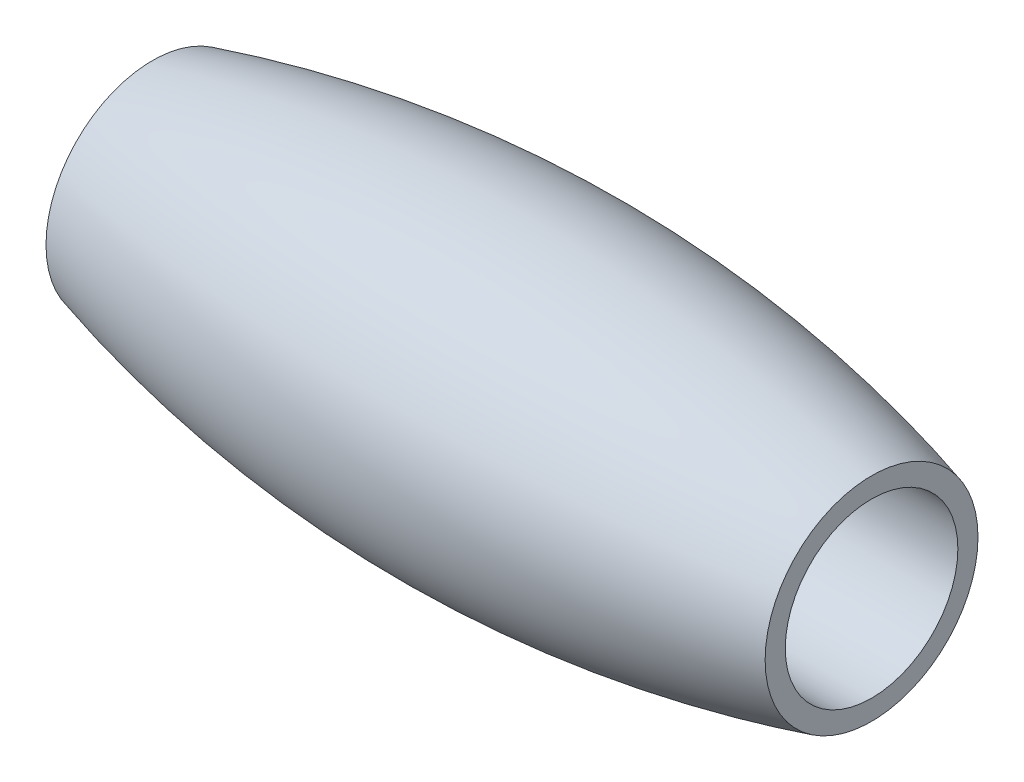
ISO-10303-21;
HEADER;
FILE_DESCRIPTION(('STEP AP214'),'2;1');
FILE_NAME('part.step','',(''),(''),'','','');
FILE_SCHEMA(('AUTOMOTIVE_DESIGN { 1 0 10303 214 1 1 1 1 }'));
ENDSEC;
DATA;
#1=APPLICATION_CONTEXT('core data for automotive mechanical design processes');
#2=APPLICATION_PROTOCOL_DEFINITION('international standard','automotive_design',2000,#1);
#3=PRODUCT_CONTEXT('',#1,'mechanical');
#4=PRODUCT('Part','Part','',(#3));
#5=PRODUCT_RELATED_PRODUCT_CATEGORY('part','',(#4));
#6=PRODUCT_DEFINITION_FORMATION('','',#4);
#7=PRODUCT_DEFINITION_CONTEXT('part definition',#1,'design');
#8=PRODUCT_DEFINITION('design','',#6,#7);
#9=PRODUCT_DEFINITION_SHAPE('','',#8);
#10=(LENGTH_UNIT() NAMED_UNIT(*) SI_UNIT(.MILLI.,.METRE.));
#11=(NAMED_UNIT(*) PLANE_ANGLE_UNIT() SI_UNIT($,.RADIAN.));
#12=(NAMED_UNIT(*) SI_UNIT($,.STERADIAN.) SOLID_ANGLE_UNIT());
#13=UNCERTAINTY_MEASURE_WITH_UNIT(LENGTH_MEASURE(1.E-05),#10,'distance_accuracy_value','');
#14=(GEOMETRIC_REPRESENTATION_CONTEXT(3) GLOBAL_UNCERTAINTY_ASSIGNED_CONTEXT((#13)) GLOBAL_UNIT_ASSIGNED_CONTEXT((#10,
#11,#12)) REPRESENTATION_CONTEXT('',''));
#15=CARTESIAN_POINT('',(0.,0.,0.));
#16=DIRECTION('',(0.,0.,1.));
#17=DIRECTION('',(1.,0.,0.));
#18=AXIS2_PLACEMENT_3D('',#15,#16,#17);
#19=CARTESIAN_POINT('',(0.,0.,0.));
#20=DIRECTION('',(-1.,0.,0.));
#21=DIRECTION('',(0.,0.,1.));
#22=AXIS2_PLACEMENT_3D('',#19,#20,#21);
#23=DEGENERATE_TOROIDAL_SURFACE('',#22,62.1088235294118,70.2088235294118,.F.);
#24=CARTESIAN_POINT('',(18.75,0.,0.));
#25=DIRECTION('',(-1.,0.,0.));
#26=DIRECTION('',(0.,0.,1.));
#27=AXIS2_PLACEMENT_3D('',#24,#25,#26);
#28=CIRCLE('',#27,5.55000000000001);
#29=CARTESIAN_POINT('',(18.75,0.,5.55000000000001));
#30=VERTEX_POINT('',#29);
#31=EDGE_CURVE('E10',#30,#30,#28,.T.);
#32=ORIENTED_EDGE('',*,*,#31,.T.);
#33=EDGE_LOOP('',(#32));
#34=FACE_BOUND('',#33,.T.);
#35=CARTESIAN_POINT('',(-18.75,0.,0.));
#36=DIRECTION('',(-1.,0.,0.));
#37=DIRECTION('',(0.,0.,1.));
#38=AXIS2_PLACEMENT_3D('',#35,#36,#37);
#39=CIRCLE('',#38,5.55000000000001);
#40=CARTESIAN_POINT('',(-18.75,0.,5.55000000000001));
#41=VERTEX_POINT('',#40);
#42=EDGE_CURVE('E60',#41,#41,#39,.T.);
#43=ORIENTED_EDGE('',*,*,#42,.F.);
#44=EDGE_LOOP('',(#43));
#45=FACE_BOUND('',#44,.T.);
#46=ADVANCED_FACE('F43',(#34,#45),#23,.F.);
#47=CARTESIAN_POINT('',(18.75,5.55000000000001,0.));
#48=DIRECTION('',(1.,0.,0.));
#49=DIRECTION('',(0.,0.,-1.));
#50=AXIS2_PLACEMENT_3D('',#47,#48,#49);
#51=PLANE('',#50);
#52=CARTESIAN_POINT('',(18.75,0.,0.));
#53=DIRECTION('',(-1.,0.,0.));
#54=DIRECTION('',(0.,0.,1.));
#55=AXIS2_PLACEMENT_3D('',#52,#53,#54);
#56=CIRCLE('',#55,4.5);
#57=CARTESIAN_POINT('',(18.75,0.,4.5));
#58=VERTEX_POINT('',#57);
#59=EDGE_CURVE('E50',#58,#58,#56,.T.);
#60=ORIENTED_EDGE('',*,*,#59,.T.);
#61=EDGE_LOOP('',(#60));
#62=FACE_BOUND('',#61,.T.);
#63=ORIENTED_EDGE('',*,*,#31,.F.);
#64=EDGE_LOOP('',(#63));
#65=FACE_BOUND('',#64,.T.);
#66=ADVANCED_FACE('F71',(#62,#65),#51,.T.);
#67=CARTESIAN_POINT('',(18.75,0.,0.));
#68=DIRECTION('',(-1.,0.,0.));
#69=DIRECTION('',(0.,0.,1.));
#70=AXIS2_PLACEMENT_3D('',#67,#68,#69);
#71=CYLINDRICAL_SURFACE('',#70,4.5);
#72=CARTESIAN_POINT('',(-18.75,0.,0.));
#73=DIRECTION('',(-1.,0.,0.));
#74=DIRECTION('',(0.,0.,1.));
#75=AXIS2_PLACEMENT_3D('',#72,#73,#74);
#76=CIRCLE('',#75,4.5);
#77=CARTESIAN_POINT('',(-18.75,0.,4.5));
#78=VERTEX_POINT('',#77);
#79=EDGE_CURVE('E55',#78,#78,#76,.T.);
#80=ORIENTED_EDGE('',*,*,#79,.T.);
#81=EDGE_LOOP('',(#80));
#82=FACE_BOUND('',#81,.T.);
#83=ORIENTED_EDGE('',*,*,#59,.F.);
#84=EDGE_LOOP('',(#83));
#85=FACE_BOUND('',#84,.T.);
#86=ADVANCED_FACE('F75',(#82,#85),#71,.F.);
#87=CARTESIAN_POINT('',(-18.75,4.5,0.));
#88=DIRECTION('',(-1.,0.,0.));
#89=DIRECTION('',(0.,0.,1.));
#90=AXIS2_PLACEMENT_3D('',#87,#88,#89);
#91=PLANE('',#90);
#92=ORIENTED_EDGE('',*,*,#42,.T.);
#93=EDGE_LOOP('',(#92));
#94=FACE_BOUND('',#93,.T.);
#95=ORIENTED_EDGE('',*,*,#79,.F.);
#96=EDGE_LOOP('',(#95));
#97=FACE_BOUND('',#96,.T.);
#98=ADVANCED_FACE('F67',(#94,#97),#91,.T.);
#99=CLOSED_SHELL('',(#46,#66,#86,#98));
#100=MANIFOLD_SOLID_BREP('B2',#99);
#101=ADVANCED_BREP_SHAPE_REPRESENTATION('',(#18,#100),#14);
#102=SHAPE_DEFINITION_REPRESENTATION(#9,#101);
ENDSEC;
END-ISO-10303-21;
